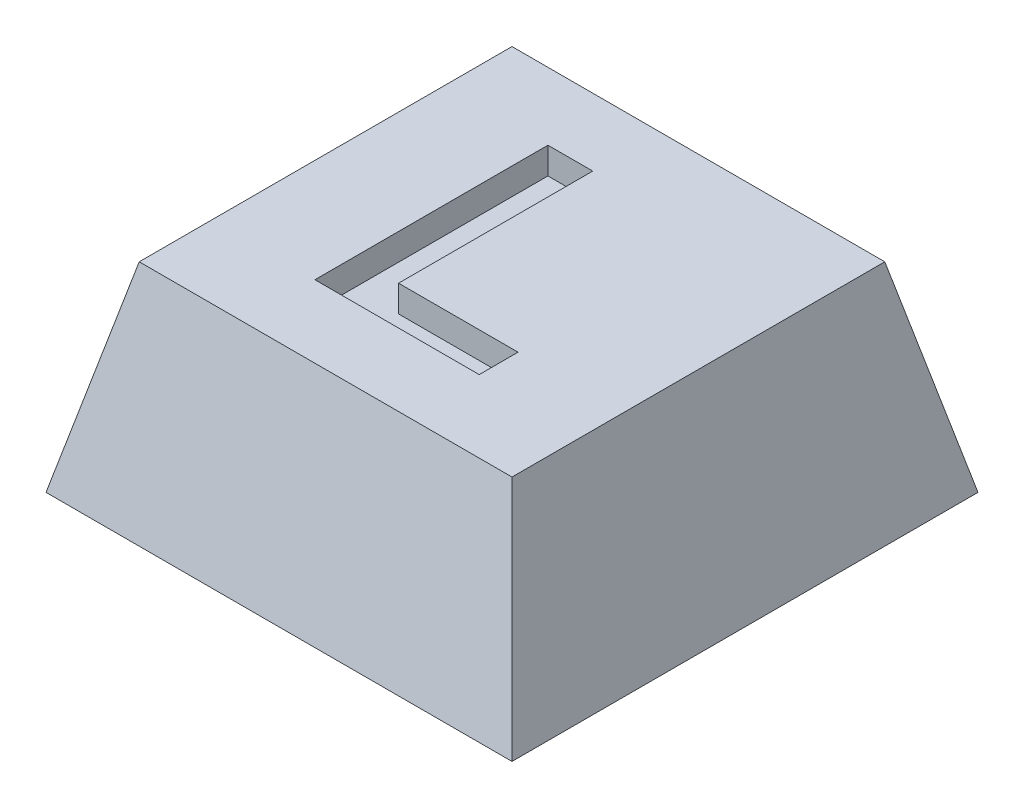
ISO-10303-21;
HEADER;
FILE_DESCRIPTION(('STEP AP214'),'2;1');
FILE_NAME('part.step','',(''),(''),'','','');
FILE_SCHEMA(('AUTOMOTIVE_DESIGN { 1 0 10303 214 1 1 1 1 }'));
ENDSEC;
DATA;
#1=APPLICATION_CONTEXT('core data for automotive mechanical design processes');
#2=APPLICATION_PROTOCOL_DEFINITION('international standard','automotive_design',2000,#1);
#3=PRODUCT_CONTEXT('',#1,'mechanical');
#4=PRODUCT('Part','Part','',(#3));
#5=PRODUCT_RELATED_PRODUCT_CATEGORY('part','',(#4));
#6=PRODUCT_DEFINITION_FORMATION('','',#4);
#7=PRODUCT_DEFINITION_CONTEXT('part definition',#1,'design');
#8=PRODUCT_DEFINITION('design','',#6,#7);
#9=PRODUCT_DEFINITION_SHAPE('','',#8);
#10=(LENGTH_UNIT() NAMED_UNIT(*) SI_UNIT(.MILLI.,.METRE.));
#11=(NAMED_UNIT(*) PLANE_ANGLE_UNIT() SI_UNIT($,.RADIAN.));
#12=(NAMED_UNIT(*) SI_UNIT($,.STERADIAN.) SOLID_ANGLE_UNIT());
#13=UNCERTAINTY_MEASURE_WITH_UNIT(LENGTH_MEASURE(1.E-05),#10,'distance_accuracy_value','');
#14=(GEOMETRIC_REPRESENTATION_CONTEXT(3) GLOBAL_UNCERTAINTY_ASSIGNED_CONTEXT((#13)) GLOBAL_UNIT_ASSIGNED_CONTEXT((#10,
#11,#12)) REPRESENTATION_CONTEXT('',''));
#15=CARTESIAN_POINT('',(0.,0.,0.));
#16=DIRECTION('',(0.,0.,1.));
#17=DIRECTION('',(1.,0.,0.));
#18=AXIS2_PLACEMENT_3D('',#15,#16,#17);
#19=CARTESIAN_POINT('',(0.,3.,0.));
#20=DIRECTION('',(0.,-1.,0.));
#21=DIRECTION('',(0.,0.,-1.));
#22=AXIS2_PLACEMENT_3D('',#19,#20,#21);
#23=PLANE('',#22);
#24=DIRECTION('',(-1.,0.,0.));
#25=VECTOR('',#24,1.);
#26=CARTESIAN_POINT('',(11.,3.,-0.7));
#27=LINE('',#26,#25);
#28=CARTESIAN_POINT('',(6.3,3.,-0.7));
#29=VERTEX_POINT('',#28);
#30=CARTESIAN_POINT('',(0.7,3.,-0.7));
#31=VERTEX_POINT('',#30);
#32=EDGE_CURVE('E65',#29,#31,#27,.T.);
#33=ORIENTED_EDGE('',*,*,#32,.F.);
#34=DIRECTION('',(0.,0.,1.));
#35=VECTOR('',#34,1.);
#36=CARTESIAN_POINT('',(6.3,3.,-7.));
#37=LINE('',#36,#35);
#38=CARTESIAN_POINT('',(6.3,3.,-6.3));
#39=VERTEX_POINT('',#38);
#40=EDGE_CURVE('E170',#39,#29,#37,.T.);
#41=ORIENTED_EDGE('',*,*,#40,.F.);
#42=DIRECTION('',(-1.,0.,0.));
#43=VECTOR('',#42,1.);
#44=CARTESIAN_POINT('',(11.,3.,-6.3));
#45=LINE('',#44,#43);
#46=CARTESIAN_POINT('',(0.699999999999998,3.,-6.3));
#47=VERTEX_POINT('',#46);
#48=EDGE_CURVE('E157',#39,#47,#45,.T.);
#49=ORIENTED_EDGE('',*,*,#48,.T.);
#50=DIRECTION('',(0.,0.,1.));
#51=VECTOR('',#50,1.);
#52=CARTESIAN_POINT('',(0.7,3.,-7.));
#53=LINE('',#52,#51);
#54=EDGE_CURVE('E171',#47,#31,#53,.T.);
#55=ORIENTED_EDGE('',*,*,#54,.T.);
#56=EDGE_LOOP('',(#33,#41,#49,#55));
#57=FACE_BOUND('',#56,.T.);
#58=DIRECTION('',(-1.,0.,0.));
#59=VECTOR('',#58,1.);
#60=CARTESIAN_POINT('',(4.72114478107457,3.,-1.78627022207766));
#61=LINE('',#60,#59);
#62=CARTESIAN_POINT('',(4.72114478107457,3.,-1.78627022207766));
#63=VERTEX_POINT('',#62);
#64=CARTESIAN_POINT('',(2.25319606312585,3.,-1.78627022207766));
#65=VERTEX_POINT('',#64);
#66=EDGE_CURVE('E58',#63,#65,#61,.T.);
#67=ORIENTED_EDGE('',*,*,#66,.T.);
#68=DIRECTION('',(0.,0.,-1.));
#69=VECTOR('',#68,1.);
#70=CARTESIAN_POINT('',(2.25319606312585,3.,-1.78627022207766));
#71=LINE('',#70,#69);
#72=CARTESIAN_POINT('',(2.25319606312585,3.,-5.28627022207766));
#73=VERTEX_POINT('',#72);
#74=EDGE_CURVE('E141',#65,#73,#71,.T.);
#75=ORIENTED_EDGE('',*,*,#74,.T.);
#76=DIRECTION('',(1.,0.,0.));
#77=VECTOR('',#76,1.);
#78=CARTESIAN_POINT('',(2.25319606312585,3.,-5.28627022207766));
#79=LINE('',#78,#77);
#80=CARTESIAN_POINT('',(2.92627298620277,3.,-5.28627022207766));
#81=VERTEX_POINT('',#80);
#82=EDGE_CURVE('E390',#73,#81,#79,.T.);
#83=ORIENTED_EDGE('',*,*,#82,.T.);
#84=DIRECTION('',(0.,0.,1.));
#85=VECTOR('',#84,1.);
#86=CARTESIAN_POINT('',(2.92627298620277,3.,-5.28627022207766));
#87=LINE('',#86,#85);
#88=CARTESIAN_POINT('',(2.92627298620277,3.,-2.36960355541099));
#89=VERTEX_POINT('',#88);
#90=EDGE_CURVE('E385',#81,#89,#87,.T.);
#91=ORIENTED_EDGE('',*,*,#90,.T.);
#92=DIRECTION('',(1.,0.,0.));
#93=VECTOR('',#92,1.);
#94=CARTESIAN_POINT('',(2.92627298620277,3.,-2.36960355541099));
#95=LINE('',#94,#93);
#96=CARTESIAN_POINT('',(4.72114478107457,3.,-2.36960355541099));
#97=VERTEX_POINT('',#96);
#98=EDGE_CURVE('E379',#89,#97,#95,.T.);
#99=ORIENTED_EDGE('',*,*,#98,.T.);
#100=DIRECTION('',(0.,0.,1.));
#101=VECTOR('',#100,1.);
#102=CARTESIAN_POINT('',(4.72114478107457,3.,-2.36960355541099));
#103=LINE('',#102,#101);
#104=EDGE_CURVE('E137',#97,#63,#103,.T.);
#105=ORIENTED_EDGE('',*,*,#104,.T.);
#106=EDGE_LOOP('',(#67,#75,#83,#91,#99,#105));
#107=FACE_BOUND('',#106,.T.);
#108=ADVANCED_FACE('F42',(#57,#107),#23,.F.);
#109=CARTESIAN_POINT('',(7.,0.,-7.));
#110=DIRECTION('',(-0.973841209741793,-0.227229615606418,0.));
#111=DIRECTION('',(0.227229615606418,-0.973841209741793,0.));
#112=AXIS2_PLACEMENT_3D('',#109,#110,#111);
#113=PLANE('',#112);
#114=DIRECTION('',(-0.221581128241521,0.949633406749377,-0.221581128241521));
#115=VECTOR('',#114,1.);
#116=CARTESIAN_POINT('',(6.6563126252505,1.47294589178357,-0.343687374749499));
#117=LINE('',#116,#115);
#118=CARTESIAN_POINT('',(7.,0.,0.));
#119=VERTEX_POINT('',#118);
#120=EDGE_CURVE('E167',#119,#29,#117,.T.);
#121=ORIENTED_EDGE('',*,*,#120,.F.);
#122=DIRECTION('',(0.,0.,-1.));
#123=VECTOR('',#122,1.);
#124=CARTESIAN_POINT('',(7.,0.,0.));
#125=LINE('',#124,#123);
#126=CARTESIAN_POINT('',(7.,0.,-7.));
#127=VERTEX_POINT('',#126);
#128=EDGE_CURVE('E185',#119,#127,#125,.T.);
#129=ORIENTED_EDGE('',*,*,#128,.T.);
#130=DIRECTION('',(0.221581128241521,-0.949633406749377,-0.221581128241521));
#131=VECTOR('',#130,1.);
#132=CARTESIAN_POINT('',(7.,0.,-7.));
#133=LINE('',#132,#131);
#134=EDGE_CURVE('E161',#39,#127,#133,.T.);
#135=ORIENTED_EDGE('',*,*,#134,.F.);
#136=ORIENTED_EDGE('',*,*,#40,.T.);
#137=EDGE_LOOP('',(#121,#129,#135,#136));
#138=FACE_BOUND('',#137,.T.);
#139=ADVANCED_FACE('F210',(#138),#113,.F.);
#140=CARTESIAN_POINT('',(0.,0.,-7.));
#141=DIRECTION('',(0.973841209741793,-0.227229615606418,0.));
#142=DIRECTION('',(0.227229615606418,0.973841209741793,0.));
#143=AXIS2_PLACEMENT_3D('',#140,#141,#142);
#144=PLANE('',#143);
#145=DIRECTION('',(-0.221581128241521,-0.949633406749378,0.221581128241521));
#146=VECTOR('',#145,1.);
#147=CARTESIAN_POINT('',(0.343687374749499,1.47294589178357,-0.3436873747495));
#148=LINE('',#147,#146);
#149=CARTESIAN_POINT('',(0.,0.,0.));
#150=VERTEX_POINT('',#149);
#151=EDGE_CURVE('E11',#31,#150,#148,.T.);
#152=ORIENTED_EDGE('',*,*,#151,.F.);
#153=ORIENTED_EDGE('',*,*,#54,.F.);
#154=DIRECTION('',(0.221581128241521,0.949633406749377,0.221581128241521));
#155=VECTOR('',#154,1.);
#156=CARTESIAN_POINT('',(0.,0.,-7.));
#157=LINE('',#156,#155);
#158=CARTESIAN_POINT('',(0.,0.,-7.));
#159=VERTEX_POINT('',#158);
#160=EDGE_CURVE('E51',#159,#47,#157,.T.);
#161=ORIENTED_EDGE('',*,*,#160,.F.);
#162=DIRECTION('',(0.,0.,1.));
#163=VECTOR('',#162,1.);
#164=CARTESIAN_POINT('',(0.,0.,0.));
#165=LINE('',#164,#163);
#166=EDGE_CURVE('E175',#159,#150,#165,.T.);
#167=ORIENTED_EDGE('',*,*,#166,.T.);
#168=EDGE_LOOP('',(#152,#153,#161,#167));
#169=FACE_BOUND('',#168,.T.);
#170=ADVANCED_FACE('F203',(#169),#144,.F.);
#171=CARTESIAN_POINT('',(0.,0.,0.));
#172=DIRECTION('',(0.,-1.,0.));
#173=DIRECTION('',(0.,0.,-1.));
#174=AXIS2_PLACEMENT_3D('',#171,#172,#173);
#175=PLANE('',#174);
#176=CARTESIAN_POINT('',(3.5,0.,-3.5));
#177=DIRECTION('',(0.,-1.,0.));
#178=DIRECTION('',(0.,0.,-1.));
#179=AXIS2_PLACEMENT_3D('',#176,#177,#178);
#180=CIRCLE('',#179,1.8);
#181=CARTESIAN_POINT('',(3.5,0.,-5.3));
#182=VERTEX_POINT('',#181);
#183=EDGE_CURVE('E143',#182,#182,#180,.T.);
#184=ORIENTED_EDGE('',*,*,#183,.F.);
#185=EDGE_LOOP('',(#184));
#186=FACE_BOUND('',#185,.T.);
#187=ORIENTED_EDGE('',*,*,#166,.F.);
#188=DIRECTION('',(-1.,0.,0.));
#189=VECTOR('',#188,1.);
#190=CARTESIAN_POINT('',(0.,0.,-7.));
#191=LINE('',#190,#189);
#192=EDGE_CURVE('E189',#127,#159,#191,.T.);
#193=ORIENTED_EDGE('',*,*,#192,.F.);
#194=ORIENTED_EDGE('',*,*,#128,.F.);
#195=DIRECTION('',(1.,0.,0.));
#196=VECTOR('',#195,1.);
#197=CARTESIAN_POINT('',(0.,0.,0.));
#198=LINE('',#197,#196);
#199=EDGE_CURVE('E182',#150,#119,#198,.T.);
#200=ORIENTED_EDGE('',*,*,#199,.F.);
#201=EDGE_LOOP('',(#187,#193,#194,#200));
#202=FACE_BOUND('',#201,.T.);
#203=ADVANCED_FACE('F44',(#186,#202),#175,.T.);
#204=CARTESIAN_POINT('',(11.,3.,-6.3));
#205=DIRECTION('',(0.,0.227229615606418,-0.973841209741793));
#206=DIRECTION('',(0.,0.973841209741793,0.227229615606418));
#207=AXIS2_PLACEMENT_3D('',#204,#205,#206);
#208=PLANE('',#207);
#209=ORIENTED_EDGE('',*,*,#134,.T.);
#210=ORIENTED_EDGE('',*,*,#192,.T.);
#211=ORIENTED_EDGE('',*,*,#160,.T.);
#212=ORIENTED_EDGE('',*,*,#48,.F.);
#213=EDGE_LOOP('',(#209,#210,#211,#212));
#214=FACE_BOUND('',#213,.T.);
#215=ADVANCED_FACE('F194',(#214),#208,.T.);
#216=CARTESIAN_POINT('',(11.,0.,0.));
#217=DIRECTION('',(0.,0.227229615606418,0.973841209741793));
#218=DIRECTION('',(0.,-0.973841209741793,0.227229615606418));
#219=AXIS2_PLACEMENT_3D('',#216,#217,#218);
#220=PLANE('',#219);
#221=ORIENTED_EDGE('',*,*,#120,.T.);
#222=ORIENTED_EDGE('',*,*,#32,.T.);
#223=ORIENTED_EDGE('',*,*,#151,.T.);
#224=ORIENTED_EDGE('',*,*,#199,.T.);
#225=EDGE_LOOP('',(#221,#222,#223,#224));
#226=FACE_BOUND('',#225,.T.);
#227=ADVANCED_FACE('F205',(#226),#220,.T.);
#228=CARTESIAN_POINT('',(3.5,0.8,-3.5));
#229=DIRECTION('',(0.,-1.,0.));
#230=DIRECTION('',(0.,0.,-1.));
#231=AXIS2_PLACEMENT_3D('',#228,#229,#230);
#232=CYLINDRICAL_SURFACE('',#231,1.8);
#233=CARTESIAN_POINT('',(3.5,0.8,-3.5));
#234=DIRECTION('',(0.,-1.,0.));
#235=DIRECTION('',(0.,0.,-1.));
#236=AXIS2_PLACEMENT_3D('',#233,#234,#235);
#237=CIRCLE('',#236,1.8);
#238=CARTESIAN_POINT('',(3.5,0.8,-5.3));
#239=VERTEX_POINT('',#238);
#240=EDGE_CURVE('E149',#239,#239,#237,.T.);
#241=ORIENTED_EDGE('',*,*,#240,.F.);
#242=EDGE_LOOP('',(#241));
#243=FACE_BOUND('',#242,.T.);
#244=ORIENTED_EDGE('',*,*,#183,.T.);
#245=EDGE_LOOP('',(#244));
#246=FACE_BOUND('',#245,.T.);
#247=ADVANCED_FACE('F230',(#243,#246),#232,.F.);
#248=CARTESIAN_POINT('',(3.5,0.8,-3.5));
#249=DIRECTION('',(0.,-1.,0.));
#250=DIRECTION('',(0.,0.,-1.));
#251=AXIS2_PLACEMENT_3D('',#248,#249,#250);
#252=PLANE('',#251);
#253=ORIENTED_EDGE('',*,*,#240,.T.);
#254=EDGE_LOOP('',(#253));
#255=FACE_BOUND('',#254,.T.);
#256=ADVANCED_FACE('F233',(#255),#252,.T.);
#257=CARTESIAN_POINT('',(4.72114478107457,2.6,-1.78627022207766));
#258=DIRECTION('',(0.,0.,-1.));
#259=DIRECTION('',(-1.,0.,0.));
#260=AXIS2_PLACEMENT_3D('',#257,#258,#259);
#261=PLANE('',#260);
#262=ORIENTED_EDGE('',*,*,#66,.F.);
#263=DIRECTION('',(0.,1.,0.));
#264=VECTOR('',#263,1.);
#265=CARTESIAN_POINT('',(4.72114478107457,2.6,-1.78627022207766));
#266=LINE('',#265,#264);
#267=CARTESIAN_POINT('',(4.72114478107457,2.6,-1.78627022207766));
#268=VERTEX_POINT('',#267);
#269=EDGE_CURVE('E135',#268,#63,#266,.T.);
#270=ORIENTED_EDGE('',*,*,#269,.F.);
#271=DIRECTION('',(-1.,0.,0.));
#272=VECTOR('',#271,1.);
#273=CARTESIAN_POINT('',(4.72114478107457,2.6,-1.78627022207766));
#274=LINE('',#273,#272);
#275=CARTESIAN_POINT('',(2.25319606312585,2.6,-1.78627022207766));
#276=VERTEX_POINT('',#275);
#277=EDGE_CURVE('E125',#268,#276,#274,.T.);
#278=ORIENTED_EDGE('',*,*,#277,.T.);
#279=DIRECTION('',(0.,1.,0.));
#280=VECTOR('',#279,1.);
#281=CARTESIAN_POINT('',(2.25319606312585,2.6,-1.78627022207766));
#282=LINE('',#281,#280);
#283=EDGE_CURVE('E134',#276,#65,#282,.T.);
#284=ORIENTED_EDGE('',*,*,#283,.T.);
#285=EDGE_LOOP('',(#262,#270,#278,#284));
#286=FACE_BOUND('',#285,.T.);
#287=ADVANCED_FACE('F133',(#286),#261,.T.);
#288=CARTESIAN_POINT('',(2.25319606312585,2.6,-1.78627022207766));
#289=DIRECTION('',(1.,0.,0.));
#290=DIRECTION('',(0.,0.,-1.));
#291=AXIS2_PLACEMENT_3D('',#288,#289,#290);
#292=PLANE('',#291);
#293=ORIENTED_EDGE('',*,*,#74,.F.);
#294=ORIENTED_EDGE('',*,*,#283,.F.);
#295=DIRECTION('',(0.,0.,-1.));
#296=VECTOR('',#295,1.);
#297=CARTESIAN_POINT('',(2.25319606312585,2.6,-1.78627022207766));
#298=LINE('',#297,#296);
#299=CARTESIAN_POINT('',(2.25319606312585,2.6,-5.28627022207766));
#300=VERTEX_POINT('',#299);
#301=EDGE_CURVE('E121',#276,#300,#298,.T.);
#302=ORIENTED_EDGE('',*,*,#301,.T.);
#303=DIRECTION('',(0.,1.,0.));
#304=VECTOR('',#303,1.);
#305=CARTESIAN_POINT('',(2.25319606312585,2.6,-5.28627022207766));
#306=LINE('',#305,#304);
#307=EDGE_CURVE('E144',#300,#73,#306,.T.);
#308=ORIENTED_EDGE('',*,*,#307,.T.);
#309=EDGE_LOOP('',(#293,#294,#302,#308));
#310=FACE_BOUND('',#309,.T.);
#311=ADVANCED_FACE('F139',(#310),#292,.T.);
#312=CARTESIAN_POINT('',(2.25319606312585,2.6,-5.28627022207766));
#313=DIRECTION('',(0.,0.,1.));
#314=DIRECTION('',(1.,0.,0.));
#315=AXIS2_PLACEMENT_3D('',#312,#313,#314);
#316=PLANE('',#315);
#317=ORIENTED_EDGE('',*,*,#82,.F.);
#318=ORIENTED_EDGE('',*,*,#307,.F.);
#319=DIRECTION('',(1.,0.,0.));
#320=VECTOR('',#319,1.);
#321=CARTESIAN_POINT('',(2.25319606312585,2.6,-5.28627022207766));
#322=LINE('',#321,#320);
#323=CARTESIAN_POINT('',(2.92627298620277,2.6,-5.28627022207766));
#324=VERTEX_POINT('',#323);
#325=EDGE_CURVE('E127',#300,#324,#322,.T.);
#326=ORIENTED_EDGE('',*,*,#325,.T.);
#327=DIRECTION('',(0.,1.,0.));
#328=VECTOR('',#327,1.);
#329=CARTESIAN_POINT('',(2.92627298620277,2.6,-5.28627022207766));
#330=LINE('',#329,#328);
#331=EDGE_CURVE('E151',#324,#81,#330,.T.);
#332=ORIENTED_EDGE('',*,*,#331,.T.);
#333=EDGE_LOOP('',(#317,#318,#326,#332));
#334=FACE_BOUND('',#333,.T.);
#335=ADVANCED_FACE('F242',(#334),#316,.T.);
#336=CARTESIAN_POINT('',(2.92627298620277,2.6,-5.28627022207766));
#337=DIRECTION('',(-1.,0.,0.));
#338=DIRECTION('',(0.,0.,1.));
#339=AXIS2_PLACEMENT_3D('',#336,#337,#338);
#340=PLANE('',#339);
#341=ORIENTED_EDGE('',*,*,#90,.F.);
#342=ORIENTED_EDGE('',*,*,#331,.F.);
#343=DIRECTION('',(0.,0.,1.));
#344=VECTOR('',#343,1.);
#345=CARTESIAN_POINT('',(2.92627298620277,2.6,-5.28627022207766));
#346=LINE('',#345,#344);
#347=CARTESIAN_POINT('',(2.92627298620277,2.6,-2.36960355541099));
#348=VERTEX_POINT('',#347);
#349=EDGE_CURVE('E415',#324,#348,#346,.T.);
#350=ORIENTED_EDGE('',*,*,#349,.T.);
#351=DIRECTION('',(0.,1.,0.));
#352=VECTOR('',#351,1.);
#353=CARTESIAN_POINT('',(2.92627298620277,2.6,-2.36960355541099));
#354=LINE('',#353,#352);
#355=EDGE_CURVE('E399',#348,#89,#354,.T.);
#356=ORIENTED_EDGE('',*,*,#355,.T.);
#357=EDGE_LOOP('',(#341,#342,#350,#356));
#358=FACE_BOUND('',#357,.T.);
#359=ADVANCED_FACE('F245',(#358),#340,.T.);
#360=CARTESIAN_POINT('',(2.92627298620277,2.6,-2.36960355541099));
#361=DIRECTION('',(0.,0.,1.));
#362=DIRECTION('',(1.,0.,0.));
#363=AXIS2_PLACEMENT_3D('',#360,#361,#362);
#364=PLANE('',#363);
#365=ORIENTED_EDGE('',*,*,#98,.F.);
#366=ORIENTED_EDGE('',*,*,#355,.F.);
#367=DIRECTION('',(1.,0.,0.));
#368=VECTOR('',#367,1.);
#369=CARTESIAN_POINT('',(2.92627298620277,2.6,-2.36960355541099));
#370=LINE('',#369,#368);
#371=CARTESIAN_POINT('',(4.72114478107457,2.6,-2.36960355541099));
#372=VERTEX_POINT('',#371);
#373=EDGE_CURVE('E412',#348,#372,#370,.T.);
#374=ORIENTED_EDGE('',*,*,#373,.T.);
#375=DIRECTION('',(0.,1.,0.));
#376=VECTOR('',#375,1.);
#377=CARTESIAN_POINT('',(4.72114478107457,2.6,-2.36960355541099));
#378=LINE('',#377,#376);
#379=EDGE_CURVE('E377',#372,#97,#378,.T.);
#380=ORIENTED_EDGE('',*,*,#379,.T.);
#381=EDGE_LOOP('',(#365,#366,#374,#380));
#382=FACE_BOUND('',#381,.T.);
#383=ADVANCED_FACE('F249',(#382),#364,.T.);
#384=CARTESIAN_POINT('',(4.72114478107457,2.6,-2.36960355541099));
#385=DIRECTION('',(-1.,0.,0.));
#386=DIRECTION('',(0.,0.,1.));
#387=AXIS2_PLACEMENT_3D('',#384,#385,#386);
#388=PLANE('',#387);
#389=ORIENTED_EDGE('',*,*,#104,.F.);
#390=ORIENTED_EDGE('',*,*,#379,.F.);
#391=DIRECTION('',(0.,0.,1.));
#392=VECTOR('',#391,1.);
#393=CARTESIAN_POINT('',(4.72114478107457,2.6,-2.36960355541099));
#394=LINE('',#393,#392);
#395=EDGE_CURVE('E396',#372,#268,#394,.T.);
#396=ORIENTED_EDGE('',*,*,#395,.T.);
#397=ORIENTED_EDGE('',*,*,#269,.T.);
#398=EDGE_LOOP('',(#389,#390,#396,#397));
#399=FACE_BOUND('',#398,.T.);
#400=ADVANCED_FACE('F253',(#399),#388,.T.);
#401=CARTESIAN_POINT('',(0.,2.6,0.));
#402=DIRECTION('',(0.,-1.,0.));
#403=DIRECTION('',(0.,0.,-1.));
#404=AXIS2_PLACEMENT_3D('',#401,#402,#403);
#405=PLANE('',#404);
#406=ORIENTED_EDGE('',*,*,#277,.F.);
#407=ORIENTED_EDGE('',*,*,#395,.F.);
#408=ORIENTED_EDGE('',*,*,#373,.F.);
#409=ORIENTED_EDGE('',*,*,#349,.F.);
#410=ORIENTED_EDGE('',*,*,#325,.F.);
#411=ORIENTED_EDGE('',*,*,#301,.F.);
#412=EDGE_LOOP('',(#406,#407,#408,#409,#410,#411));
#413=FACE_BOUND('',#412,.T.);
#414=ADVANCED_FACE('F123',(#413),#405,.F.);
#415=CLOSED_SHELL('',(#108,#139,#170,#203,#215,#227,#247,#256,#287,#311,#335,#359,#383,#400,#414));
#416=MANIFOLD_SOLID_BREP('B2',#415);
#417=ADVANCED_BREP_SHAPE_REPRESENTATION('',(#18,#416),#14);
#418=SHAPE_DEFINITION_REPRESENTATION(#9,#417);
ENDSEC;
END-ISO-10303-21;
